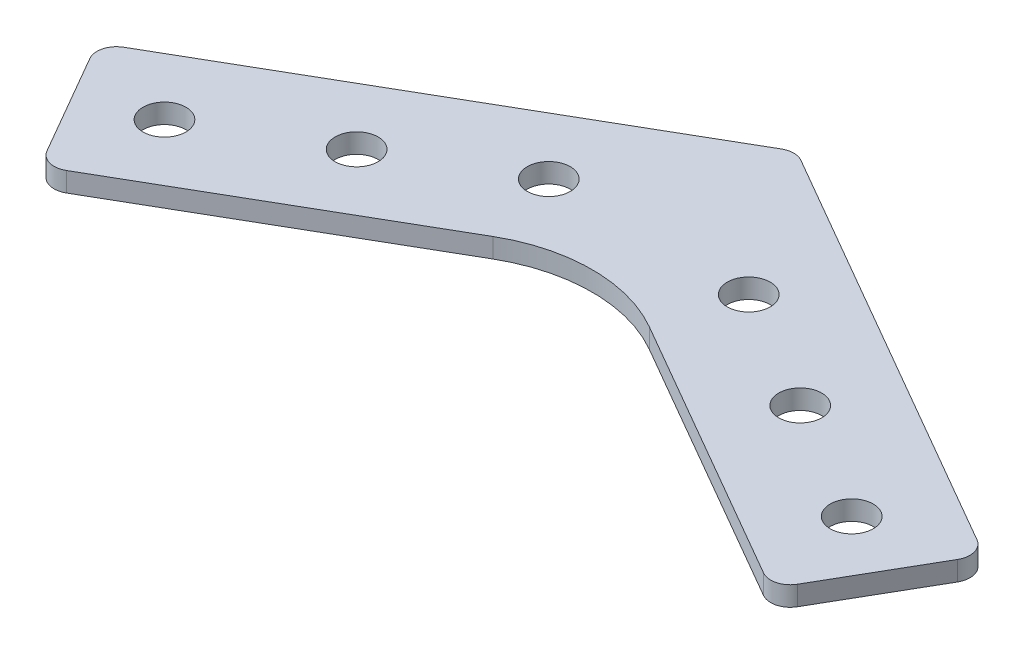
ISO-10303-21;
HEADER;
FILE_DESCRIPTION(('STEP AP214'),'2;1');
FILE_NAME('part.step','',(''),(''),'','','');
FILE_SCHEMA(('AUTOMOTIVE_DESIGN { 1 0 10303 214 1 1 1 1 }'));
ENDSEC;
DATA;
#1=APPLICATION_CONTEXT('core data for automotive mechanical design processes');
#2=APPLICATION_PROTOCOL_DEFINITION('international standard','automotive_design',2000,#1);
#3=PRODUCT_CONTEXT('',#1,'mechanical');
#4=PRODUCT('Part','Part','',(#3));
#5=PRODUCT_RELATED_PRODUCT_CATEGORY('part','',(#4));
#6=PRODUCT_DEFINITION_FORMATION('','',#4);
#7=PRODUCT_DEFINITION_CONTEXT('part definition',#1,'design');
#8=PRODUCT_DEFINITION('design','',#6,#7);
#9=PRODUCT_DEFINITION_SHAPE('','',#8);
#10=(LENGTH_UNIT() NAMED_UNIT(*) SI_UNIT(.MILLI.,.METRE.));
#11=(NAMED_UNIT(*) PLANE_ANGLE_UNIT() SI_UNIT($,.RADIAN.));
#12=(NAMED_UNIT(*) SI_UNIT($,.STERADIAN.) SOLID_ANGLE_UNIT());
#13=UNCERTAINTY_MEASURE_WITH_UNIT(LENGTH_MEASURE(1.E-05),#10,'distance_accuracy_value','');
#14=(GEOMETRIC_REPRESENTATION_CONTEXT(3) GLOBAL_UNCERTAINTY_ASSIGNED_CONTEXT((#13)) GLOBAL_UNIT_ASSIGNED_CONTEXT((#10,
#11,#12)) REPRESENTATION_CONTEXT('',''));
#15=CARTESIAN_POINT('',(0.,0.,0.));
#16=DIRECTION('',(0.,0.,1.));
#17=DIRECTION('',(1.,0.,0.));
#18=AXIS2_PLACEMENT_3D('',#15,#16,#17);
#19=CARTESIAN_POINT('',(-59.3920221915368,3.175,34.29));
#20=DIRECTION('',(-0.866025403784439,0.,0.5));
#21=DIRECTION('',(0.5,0.,0.866025403784439));
#22=AXIS2_PLACEMENT_3D('',#19,#20,#21);
#23=PLANE('',#22);
#24=DIRECTION('',(-0.5,0.,-0.866025403784439));
#25=VECTOR('',#24,1.);
#26=CARTESIAN_POINT('',(-59.3920221915368,3.175,34.29));
#27=LINE('',#26,#25);
#28=CARTESIAN_POINT('',(-60.9795221915368,3.175,31.5403693429844));
#29=VERTEX_POINT('',#28);
#30=CARTESIAN_POINT('',(-70.5045221915368,3.175,15.0425854008908));
#31=VERTEX_POINT('',#30);
#32=EDGE_CURVE('E210',#29,#31,#27,.T.);
#33=ORIENTED_EDGE('',*,*,#32,.T.);
#34=DIRECTION('',(0.,-1.,0.));
#35=VECTOR('',#34,1.);
#36=CARTESIAN_POINT('',(-70.5045221915368,3.175,15.0425854008908));
#37=LINE('',#36,#35);
#38=CARTESIAN_POINT('',(-70.5045221915368,0.,15.0425854008908));
#39=VERTEX_POINT('',#38);
#40=EDGE_CURVE('E146',#31,#39,#37,.T.);
#41=ORIENTED_EDGE('',*,*,#40,.T.);
#42=DIRECTION('',(-0.5,0.,-0.866025403784439));
#43=VECTOR('',#42,1.);
#44=CARTESIAN_POINT('',(-59.3920221915368,0.,34.29));
#45=LINE('',#44,#43);
#46=CARTESIAN_POINT('',(-60.9795221915368,0.,31.5403693429844));
#47=VERTEX_POINT('',#46);
#48=EDGE_CURVE('E130',#47,#39,#45,.T.);
#49=ORIENTED_EDGE('',*,*,#48,.F.);
#50=DIRECTION('',(0.,-1.,0.));
#51=VECTOR('',#50,1.);
#52=CARTESIAN_POINT('',(-60.9795221915368,3.175,31.5403693429844));
#53=LINE('',#52,#51);
#54=EDGE_CURVE('E143',#47,#29,#53,.F.);
#55=ORIENTED_EDGE('',*,*,#54,.T.);
#56=EDGE_LOOP('',(#33,#41,#49,#55));
#57=FACE_BOUND('',#56,.T.);
#58=ADVANCED_FACE('F40',(#57),#23,.T.);
#59=CARTESIAN_POINT('',(0.,3.175,0.));
#60=DIRECTION('',(0.5,0.,0.866025403784439));
#61=DIRECTION('',(0.866025403784439,0.,-0.5));
#62=AXIS2_PLACEMENT_3D('',#59,#60,#61);
#63=PLANE('',#62);
#64=DIRECTION('',(-0.866025403784439,0.,0.5));
#65=VECTOR('',#64,1.);
#66=CARTESIAN_POINT('',(0.,0.,0.));
#67=LINE('',#66,#65);
#68=CARTESIAN_POINT('',(-12.7,0.,7.33234841870827));
#69=VERTEX_POINT('',#68);
#70=CARTESIAN_POINT('',(-56.6423915345212,0.,32.7025));
#71=VERTEX_POINT('',#70);
#72=EDGE_CURVE('E132',#69,#71,#67,.T.);
#73=ORIENTED_EDGE('',*,*,#72,.F.);
#74=DIRECTION('',(0.,-1.,0.));
#75=VECTOR('',#74,1.);
#76=CARTESIAN_POINT('',(-12.7,3.175,7.33234841870827));
#77=LINE('',#76,#75);
#78=CARTESIAN_POINT('',(-12.7,3.175,7.33234841870827));
#79=VERTEX_POINT('',#78);
#80=EDGE_CURVE('E191',#69,#79,#77,.F.);
#81=ORIENTED_EDGE('',*,*,#80,.T.);
#82=DIRECTION('',(-0.866025403784439,0.,0.5));
#83=VECTOR('',#82,1.);
#84=CARTESIAN_POINT('',(0.,3.175,0.));
#85=LINE('',#84,#83);
#86=CARTESIAN_POINT('',(-56.6423915345212,3.175,32.7025));
#87=VERTEX_POINT('',#86);
#88=EDGE_CURVE('E226',#79,#87,#85,.T.);
#89=ORIENTED_EDGE('',*,*,#88,.T.);
#90=DIRECTION('',(0.,-1.,0.));
#91=VECTOR('',#90,1.);
#92=CARTESIAN_POINT('',(-56.6423915345212,3.175,32.7025));
#93=LINE('',#92,#91);
#94=EDGE_CURVE('E176',#87,#71,#93,.T.);
#95=ORIENTED_EDGE('',*,*,#94,.T.);
#96=EDGE_LOOP('',(#73,#81,#89,#95));
#97=FACE_BOUND('',#96,.T.);
#98=ADVANCED_FACE('F299',(#97),#63,.T.);
#99=CARTESIAN_POINT('',(59.3920221915367,3.175,34.2900000000001));
#100=DIRECTION('',(-0.500000000000002,0.,0.866025403784438));
#101=DIRECTION('',(0.866025403784438,0.,0.500000000000002));
#102=AXIS2_PLACEMENT_3D('',#99,#100,#101);
#103=PLANE('',#102);
#104=DIRECTION('',(-0.866025403784438,0.,-0.500000000000002));
#105=VECTOR('',#104,1.);
#106=CARTESIAN_POINT('',(59.3920221915367,3.175,34.2900000000001));
#107=LINE('',#106,#105);
#108=CARTESIAN_POINT('',(56.6423915345211,3.175,32.7025000000001));
#109=VERTEX_POINT('',#108);
#110=CARTESIAN_POINT('',(12.7,3.175,7.33234841870828));
#111=VERTEX_POINT('',#110);
#112=EDGE_CURVE('E223',#109,#111,#107,.T.);
#113=ORIENTED_EDGE('',*,*,#112,.T.);
#114=DIRECTION('',(0.,-1.,0.));
#115=VECTOR('',#114,1.);
#116=CARTESIAN_POINT('',(12.7,0.,7.33234841870829));
#117=LINE('',#116,#115);
#118=CARTESIAN_POINT('',(12.7,0.,7.33234841870828));
#119=VERTEX_POINT('',#118);
#120=EDGE_CURVE('E188',#111,#119,#117,.T.);
#121=ORIENTED_EDGE('',*,*,#120,.T.);
#122=DIRECTION('',(-0.866025403784438,0.,-0.500000000000002));
#123=VECTOR('',#122,1.);
#124=CARTESIAN_POINT('',(59.3920221915367,0.,34.2900000000001));
#125=LINE('',#124,#123);
#126=CARTESIAN_POINT('',(56.6423915345211,0.,32.7025000000001));
#127=VERTEX_POINT('',#126);
#128=EDGE_CURVE('E215',#127,#119,#125,.T.);
#129=ORIENTED_EDGE('',*,*,#128,.F.);
#130=DIRECTION('',(0.,-1.,0.));
#131=VECTOR('',#130,1.);
#132=CARTESIAN_POINT('',(56.6423915345211,3.175,32.7025000000001));
#133=LINE('',#132,#131);
#134=EDGE_CURVE('E186',#127,#109,#133,.F.);
#135=ORIENTED_EDGE('',*,*,#134,.T.);
#136=EDGE_LOOP('',(#113,#121,#129,#135));
#137=FACE_BOUND('',#136,.T.);
#138=ADVANCED_FACE('F304',(#137),#103,.T.);
#139=CARTESIAN_POINT('',(59.3920221915367,3.175,34.2900000000001));
#140=DIRECTION('',(-0.866025403784438,0.,-0.500000000000002));
#141=DIRECTION('',(-0.500000000000002,0.,0.866025403784438));
#142=AXIS2_PLACEMENT_3D('',#139,#140,#141);
#143=PLANE('',#142);
#144=DIRECTION('',(0.500000000000002,0.,-0.866025403784438));
#145=VECTOR('',#144,1.);
#146=CARTESIAN_POINT('',(59.3920221915367,0.,34.2900000000001));
#147=LINE('',#146,#145);
#148=CARTESIAN_POINT('',(60.9795221915367,0.,31.5403693429845));
#149=VERTEX_POINT('',#148);
#150=CARTESIAN_POINT('',(70.5045221915368,0.,15.042585400891));
#151=VERTEX_POINT('',#150);
#152=EDGE_CURVE('E212',#149,#151,#147,.T.);
#153=ORIENTED_EDGE('',*,*,#152,.T.);
#154=DIRECTION('',(0.,-1.,0.));
#155=VECTOR('',#154,1.);
#156=CARTESIAN_POINT('',(70.5045221915368,3.175,15.042585400891));
#157=LINE('',#156,#155);
#158=CARTESIAN_POINT('',(70.5045221915368,3.175,15.042585400891));
#159=VERTEX_POINT('',#158);
#160=EDGE_CURVE('E184',#151,#159,#157,.F.);
#161=ORIENTED_EDGE('',*,*,#160,.T.);
#162=DIRECTION('',(0.500000000000002,0.,-0.866025403784438));
#163=VECTOR('',#162,1.);
#164=CARTESIAN_POINT('',(59.3920221915367,3.175,34.2900000000001));
#165=LINE('',#164,#163);
#166=CARTESIAN_POINT('',(60.9795221915367,3.175,31.5403693429845));
#167=VERTEX_POINT('',#166);
#168=EDGE_CURVE('E157',#167,#159,#165,.T.);
#169=ORIENTED_EDGE('',*,*,#168,.F.);
#170=DIRECTION('',(0.,-1.,0.));
#171=VECTOR('',#170,1.);
#172=CARTESIAN_POINT('',(60.9795221915367,0.,31.5403693429845));
#173=LINE('',#172,#171);
#174=EDGE_CURVE('E181',#167,#149,#173,.T.);
#175=ORIENTED_EDGE('',*,*,#174,.T.);
#176=EDGE_LOOP('',(#153,#161,#169,#175));
#177=FACE_BOUND('',#176,.T.);
#178=ADVANCED_FACE('F328',(#177),#143,.F.);
#179=CARTESIAN_POINT('',(0.,3.175,-29.329393674833));
#180=DIRECTION('',(0.500000000000001,0.,-0.866025403784438));
#181=DIRECTION('',(-0.866025403784438,0.,-0.500000000000001));
#182=AXIS2_PLACEMENT_3D('',#179,#180,#181);
#183=PLANE('',#182);
#184=DIRECTION('',(0.866025403784438,0.,0.500000000000001));
#185=VECTOR('',#184,1.);
#186=CARTESIAN_POINT('',(0.,0.,-29.329393674833));
#187=LINE('',#186,#185);
#188=CARTESIAN_POINT('',(1.5875,0.,-28.4128501224945));
#189=VERTEX_POINT('',#188);
#190=CARTESIAN_POINT('',(69.3423915345212,0.,10.7054547438754));
#191=VERTEX_POINT('',#190);
#192=EDGE_CURVE('E209',#189,#191,#187,.T.);
#193=ORIENTED_EDGE('',*,*,#192,.F.);
#194=DIRECTION('',(0.,-1.,0.));
#195=VECTOR('',#194,1.);
#196=CARTESIAN_POINT('',(1.5875,3.175,-28.4128501224945));
#197=LINE('',#196,#195);
#198=CARTESIAN_POINT('',(1.58750000000001,3.175,-28.4128501224945));
#199=VERTEX_POINT('',#198);
#200=EDGE_CURVE('E48',#189,#199,#197,.F.);
#201=ORIENTED_EDGE('',*,*,#200,.T.);
#202=DIRECTION('',(-0.866025403784438,0.,-0.500000000000002));
#203=VECTOR('',#202,1.);
#204=CARTESIAN_POINT('',(72.0920221915368,3.175,12.2929547438754));
#205=LINE('',#204,#203);
#206=CARTESIAN_POINT('',(69.3423915345212,3.175,10.7054547438754));
#207=VERTEX_POINT('',#206);
#208=EDGE_CURVE('E153',#207,#199,#205,.T.);
#209=ORIENTED_EDGE('',*,*,#208,.F.);
#210=DIRECTION('',(0.,-1.,0.));
#211=VECTOR('',#210,1.);
#212=CARTESIAN_POINT('',(69.3423915345212,0.,10.7054547438754));
#213=LINE('',#212,#211);
#214=EDGE_CURVE('E178',#207,#191,#213,.T.);
#215=ORIENTED_EDGE('',*,*,#214,.T.);
#216=EDGE_LOOP('',(#193,#201,#209,#215));
#217=FACE_BOUND('',#216,.T.);
#218=ADVANCED_FACE('F331',(#217),#183,.T.);
#219=CARTESIAN_POINT('',(-25.3999999999999,3.175,-14.6646968374165));
#220=DIRECTION('',(-0.5,0.,-0.866025403784439));
#221=DIRECTION('',(-0.866025403784439,0.,0.5));
#222=AXIS2_PLACEMENT_3D('',#219,#220,#221);
#223=PLANE('',#222);
#224=DIRECTION('',(-0.866025403784438,0.,0.5));
#225=VECTOR('',#224,1.);
#226=CARTESIAN_POINT('',(-25.3999999999999,3.175,-14.6646968374165));
#227=LINE('',#226,#225);
#228=CARTESIAN_POINT('',(-1.58750000000001,3.175,-28.4128501224945));
#229=VERTEX_POINT('',#228);
#230=CARTESIAN_POINT('',(-69.3423915345212,3.175,10.7054547438753));
#231=VERTEX_POINT('',#230);
#232=EDGE_CURVE('E206',#229,#231,#227,.T.);
#233=ORIENTED_EDGE('',*,*,#232,.F.);
#234=DIRECTION('',(0.,-1.,0.));
#235=VECTOR('',#234,1.);
#236=CARTESIAN_POINT('',(-1.5875,3.175,-28.4128501224945));
#237=LINE('',#236,#235);
#238=CARTESIAN_POINT('',(-1.5875,0.,-28.4128501224945));
#239=VERTEX_POINT('',#238);
#240=EDGE_CURVE('E197',#229,#239,#237,.T.);
#241=ORIENTED_EDGE('',*,*,#240,.T.);
#242=DIRECTION('',(0.866025403784439,0.,-0.5));
#243=VECTOR('',#242,1.);
#244=CARTESIAN_POINT('',(-25.3999999999999,0.,-14.6646968374165));
#245=LINE('',#244,#243);
#246=CARTESIAN_POINT('',(-69.3423915345212,0.,10.7054547438752));
#247=VERTEX_POINT('',#246);
#248=EDGE_CURVE('E160',#247,#239,#245,.T.);
#249=ORIENTED_EDGE('',*,*,#248,.F.);
#250=DIRECTION('',(0.,-1.,0.));
#251=VECTOR('',#250,1.);
#252=CARTESIAN_POINT('',(-69.3423915345212,3.175,10.7054547438752));
#253=LINE('',#252,#251);
#254=EDGE_CURVE('E166',#247,#231,#253,.F.);
#255=ORIENTED_EDGE('',*,*,#254,.T.);
#256=EDGE_LOOP('',(#233,#241,#249,#255));
#257=FACE_BOUND('',#256,.T.);
#258=ADVANCED_FACE('F204',(#257),#223,.T.);
#259=CARTESIAN_POINT('',(0.,3.175,0.));
#260=DIRECTION('',(0.,-1.,0.));
#261=DIRECTION('',(0.,0.,-1.));
#262=AXIS2_PLACEMENT_3D('',#259,#260,#261);
#263=PLANE('',#262);
#264=CARTESIAN_POINT('',(36.0460110957684,3.175,6.14647737193771));
#265=DIRECTION('',(0.,1.,0.));
#266=DIRECTION('',(0.,0.,1.));
#267=AXIS2_PLACEMENT_3D('',#264,#265,#266);
#268=CIRCLE('',#267,3.4925);
#269=CARTESIAN_POINT('',(36.0460110957684,3.175,9.63897737193771));
#270=VERTEX_POINT('',#269);
#271=EDGE_CURVE('E259',#270,#270,#268,.T.);
#272=ORIENTED_EDGE('',*,*,#271,.F.);
#273=EDGE_LOOP('',(#272));
#274=FACE_BOUND('',#273,.T.);
#275=CARTESIAN_POINT('',(16.2486703652561,3.175,-5.28352262806232));
#276=DIRECTION('',(0.,1.,0.));
#277=DIRECTION('',(0.,0.,1.));
#278=AXIS2_PLACEMENT_3D('',#275,#276,#277);
#279=CIRCLE('',#278,3.4925);
#280=CARTESIAN_POINT('',(16.2486703652561,3.175,-1.79102262806232));
#281=VERTEX_POINT('',#280);
#282=EDGE_CURVE('E253',#281,#281,#279,.T.);
#283=ORIENTED_EDGE('',*,*,#282,.F.);
#284=EDGE_LOOP('',(#283));
#285=FACE_BOUND('',#284,.T.);
#286=CARTESIAN_POINT('',(55.8433518262806,3.175,17.5764773719377));
#287=DIRECTION('',(0.,1.,0.));
#288=DIRECTION('',(0.,0.,1.));
#289=AXIS2_PLACEMENT_3D('',#286,#287,#288);
#290=CIRCLE('',#289,3.4925);
#291=CARTESIAN_POINT('',(55.8433518262806,3.175,21.0689773719377));
#292=VERTEX_POINT('',#291);
#293=EDGE_CURVE('E247',#292,#292,#290,.T.);
#294=ORIENTED_EDGE('',*,*,#293,.F.);
#295=EDGE_LOOP('',(#294));
#296=FACE_BOUND('',#295,.T.);
#297=CARTESIAN_POINT('',(-36.0460110957684,3.175,6.14647737193763));
#298=DIRECTION('',(0.,1.,0.));
#299=DIRECTION('',(0.,0.,1.));
#300=AXIS2_PLACEMENT_3D('',#297,#298,#299);
#301=CIRCLE('',#300,3.49250000000001);
#302=CARTESIAN_POINT('',(-36.0460110957684,3.175,9.63897737193764));
#303=VERTEX_POINT('',#302);
#304=EDGE_CURVE('E242',#303,#303,#301,.T.);
#305=ORIENTED_EDGE('',*,*,#304,.F.);
#306=EDGE_LOOP('',(#305));
#307=FACE_BOUND('',#306,.T.);
#308=CARTESIAN_POINT('',(-16.2486703652561,3.175,-5.28352262806237));
#309=DIRECTION('',(0.,1.,0.));
#310=DIRECTION('',(0.,0.,1.));
#311=AXIS2_PLACEMENT_3D('',#308,#309,#310);
#312=CIRCLE('',#311,3.49250000000001);
#313=CARTESIAN_POINT('',(-16.2486703652561,3.175,-1.79102262806237));
#314=VERTEX_POINT('',#313);
#315=EDGE_CURVE('E235',#314,#314,#312,.T.);
#316=ORIENTED_EDGE('',*,*,#315,.F.);
#317=EDGE_LOOP('',(#316));
#318=FACE_BOUND('',#317,.T.);
#319=CARTESIAN_POINT('',(-55.8433518262807,3.175,17.5764773719376));
#320=DIRECTION('',(0.,1.,0.));
#321=DIRECTION('',(0.,0.,1.));
#322=AXIS2_PLACEMENT_3D('',#319,#320,#321);
#323=CIRCLE('',#322,3.49250000000001);
#324=CARTESIAN_POINT('',(-55.8433518262807,3.175,21.0689773719376));
#325=VERTEX_POINT('',#324);
#326=EDGE_CURVE('E229',#325,#325,#323,.T.);
#327=ORIENTED_EDGE('',*,*,#326,.F.);
#328=EDGE_LOOP('',(#327));
#329=FACE_BOUND('',#328,.T.);
#330=ORIENTED_EDGE('',*,*,#208,.T.);
#331=CARTESIAN_POINT('',(0.,3.175,-25.6632194654789));
#332=DIRECTION('',(0.,-1.,0.));
#333=DIRECTION('',(0.,0.,-1.));
#334=AXIS2_PLACEMENT_3D('',#331,#332,#333);
#335=CIRCLE('',#334,3.175);
#336=EDGE_CURVE('E11',#199,#229,#335,.F.);
#337=ORIENTED_EDGE('',*,*,#336,.T.);
#338=ORIENTED_EDGE('',*,*,#232,.T.);
#339=CARTESIAN_POINT('',(-67.7548915345212,3.175,13.4550854008908));
#340=DIRECTION('',(0.,-1.,0.));
#341=DIRECTION('',(0.,0.,-1.));
#342=AXIS2_PLACEMENT_3D('',#339,#340,#341);
#343=CIRCLE('',#342,3.175);
#344=EDGE_CURVE('E174',#231,#31,#343,.F.);
#345=ORIENTED_EDGE('',*,*,#344,.T.);
#346=ORIENTED_EDGE('',*,*,#32,.F.);
#347=CARTESIAN_POINT('',(-58.2298915345212,3.175,29.9528693429844));
#348=DIRECTION('',(0.,-1.,0.));
#349=DIRECTION('',(0.,0.,-1.));
#350=AXIS2_PLACEMENT_3D('',#347,#348,#349);
#351=CIRCLE('',#350,3.175);
#352=EDGE_CURVE('E152',#29,#87,#351,.F.);
#353=ORIENTED_EDGE('',*,*,#352,.T.);
#354=ORIENTED_EDGE('',*,*,#88,.F.);
#355=CARTESIAN_POINT('',(0.,3.175,29.329393674833));
#356=DIRECTION('',(0.,-1.,0.));
#357=DIRECTION('',(0.,0.,-1.));
#358=AXIS2_PLACEMENT_3D('',#355,#356,#357);
#359=CIRCLE('',#358,25.4);
#360=EDGE_CURVE('E195',#79,#111,#359,.T.);
#361=ORIENTED_EDGE('',*,*,#360,.T.);
#362=ORIENTED_EDGE('',*,*,#112,.F.);
#363=CARTESIAN_POINT('',(58.2298915345212,3.175,29.9528693429845));
#364=DIRECTION('',(0.,-1.,0.));
#365=DIRECTION('',(0.,0.,-1.));
#366=AXIS2_PLACEMENT_3D('',#363,#364,#365);
#367=CIRCLE('',#366,3.175);
#368=EDGE_CURVE('E169',#109,#167,#367,.F.);
#369=ORIENTED_EDGE('',*,*,#368,.T.);
#370=ORIENTED_EDGE('',*,*,#168,.T.);
#371=CARTESIAN_POINT('',(67.7548915345212,3.175,13.455085400891));
#372=DIRECTION('',(0.,-1.,0.));
#373=DIRECTION('',(0.,0.,-1.));
#374=AXIS2_PLACEMENT_3D('',#371,#372,#373);
#375=CIRCLE('',#374,3.175);
#376=EDGE_CURVE('E171',#159,#207,#375,.F.);
#377=ORIENTED_EDGE('',*,*,#376,.T.);
#378=EDGE_LOOP('',(#330,#337,#338,#345,#346,#353,#354,#361,#362,#369,#370,#377));
#379=FACE_BOUND('',#378,.T.);
#380=ADVANCED_FACE('F275',(#274,#285,#296,#307,#318,#329,#379),#263,.F.);
#381=CARTESIAN_POINT('',(0.,0.,0.));
#382=DIRECTION('',(0.,-1.,0.));
#383=DIRECTION('',(0.,0.,-1.));
#384=AXIS2_PLACEMENT_3D('',#381,#382,#383);
#385=PLANE('',#384);
#386=CARTESIAN_POINT('',(36.0460110957684,0.,6.14647737193771));
#387=DIRECTION('',(0.,1.,0.));
#388=DIRECTION('',(0.,0.,1.));
#389=AXIS2_PLACEMENT_3D('',#386,#387,#388);
#390=CIRCLE('',#389,3.4925);
#391=CARTESIAN_POINT('',(36.0460110957684,0.,9.63897737193771));
#392=VERTEX_POINT('',#391);
#393=EDGE_CURVE('E250',#392,#392,#390,.T.);
#394=ORIENTED_EDGE('',*,*,#393,.T.);
#395=EDGE_LOOP('',(#394));
#396=FACE_BOUND('',#395,.T.);
#397=CARTESIAN_POINT('',(16.2486703652561,0.,-5.28352262806232));
#398=DIRECTION('',(0.,1.,0.));
#399=DIRECTION('',(0.,0.,1.));
#400=AXIS2_PLACEMENT_3D('',#397,#398,#399);
#401=CIRCLE('',#400,3.4925);
#402=CARTESIAN_POINT('',(16.2486703652561,0.,-1.79102262806232));
#403=VERTEX_POINT('',#402);
#404=EDGE_CURVE('E256',#403,#403,#401,.T.);
#405=ORIENTED_EDGE('',*,*,#404,.T.);
#406=EDGE_LOOP('',(#405));
#407=FACE_BOUND('',#406,.T.);
#408=CARTESIAN_POINT('',(55.8433518262806,0.,17.5764773719377));
#409=DIRECTION('',(0.,1.,0.));
#410=DIRECTION('',(0.,0.,1.));
#411=AXIS2_PLACEMENT_3D('',#408,#409,#410);
#412=CIRCLE('',#411,3.4925);
#413=CARTESIAN_POINT('',(55.8433518262806,0.,21.0689773719377));
#414=VERTEX_POINT('',#413);
#415=EDGE_CURVE('E239',#414,#414,#412,.T.);
#416=ORIENTED_EDGE('',*,*,#415,.T.);
#417=EDGE_LOOP('',(#416));
#418=FACE_BOUND('',#417,.T.);
#419=CARTESIAN_POINT('',(-36.0460110957684,0.,6.14647737193763));
#420=DIRECTION('',(0.,1.,0.));
#421=DIRECTION('',(0.,0.,1.));
#422=AXIS2_PLACEMENT_3D('',#419,#420,#421);
#423=CIRCLE('',#422,3.49250000000001);
#424=CARTESIAN_POINT('',(-36.0460110957684,0.,9.63897737193764));
#425=VERTEX_POINT('',#424);
#426=EDGE_CURVE('E232',#425,#425,#423,.T.);
#427=ORIENTED_EDGE('',*,*,#426,.T.);
#428=EDGE_LOOP('',(#427));
#429=FACE_BOUND('',#428,.T.);
#430=CARTESIAN_POINT('',(-16.2486703652561,0.,-5.28352262806237));
#431=DIRECTION('',(0.,1.,0.));
#432=DIRECTION('',(0.,0.,1.));
#433=AXIS2_PLACEMENT_3D('',#430,#431,#432);
#434=CIRCLE('',#433,3.49250000000001);
#435=CARTESIAN_POINT('',(-16.2486703652561,0.,-1.79102262806237));
#436=VERTEX_POINT('',#435);
#437=EDGE_CURVE('E238',#436,#436,#434,.T.);
#438=ORIENTED_EDGE('',*,*,#437,.T.);
#439=EDGE_LOOP('',(#438));
#440=FACE_BOUND('',#439,.T.);
#441=CARTESIAN_POINT('',(-55.8433518262807,0.,17.5764773719376));
#442=DIRECTION('',(0.,1.,0.));
#443=DIRECTION('',(0.,0.,1.));
#444=AXIS2_PLACEMENT_3D('',#441,#442,#443);
#445=CIRCLE('',#444,3.49250000000001);
#446=CARTESIAN_POINT('',(-55.8433518262807,0.,21.0689773719376));
#447=VERTEX_POINT('',#446);
#448=EDGE_CURVE('E147',#447,#447,#445,.T.);
#449=ORIENTED_EDGE('',*,*,#448,.T.);
#450=EDGE_LOOP('',(#449));
#451=FACE_BOUND('',#450,.T.);
#452=ORIENTED_EDGE('',*,*,#248,.T.);
#453=CARTESIAN_POINT('',(0.,0.,-25.6632194654789));
#454=DIRECTION('',(0.,-1.,0.));
#455=DIRECTION('',(0.,0.,-1.));
#456=AXIS2_PLACEMENT_3D('',#453,#454,#455);
#457=CIRCLE('',#456,3.175);
#458=EDGE_CURVE('E62',#239,#189,#457,.T.);
#459=ORIENTED_EDGE('',*,*,#458,.T.);
#460=ORIENTED_EDGE('',*,*,#192,.T.);
#461=CARTESIAN_POINT('',(67.7548915345212,0.,13.455085400891));
#462=DIRECTION('',(0.,-1.,0.));
#463=DIRECTION('',(0.,0.,-1.));
#464=AXIS2_PLACEMENT_3D('',#461,#462,#463);
#465=CIRCLE('',#464,3.175);
#466=EDGE_CURVE('E138',#191,#151,#465,.T.);
#467=ORIENTED_EDGE('',*,*,#466,.T.);
#468=ORIENTED_EDGE('',*,*,#152,.F.);
#469=CARTESIAN_POINT('',(58.2298915345212,0.,29.9528693429845));
#470=DIRECTION('',(0.,-1.,0.));
#471=DIRECTION('',(0.,0.,-1.));
#472=AXIS2_PLACEMENT_3D('',#469,#470,#471);
#473=CIRCLE('',#472,3.175);
#474=EDGE_CURVE('E155',#149,#127,#473,.T.);
#475=ORIENTED_EDGE('',*,*,#474,.T.);
#476=ORIENTED_EDGE('',*,*,#128,.T.);
#477=CARTESIAN_POINT('',(0.,0.,29.329393674833));
#478=DIRECTION('',(0.,-1.,0.));
#479=DIRECTION('',(0.,0.,-1.));
#480=AXIS2_PLACEMENT_3D('',#477,#478,#479);
#481=CIRCLE('',#480,25.4);
#482=EDGE_CURVE('E193',#119,#69,#481,.F.);
#483=ORIENTED_EDGE('',*,*,#482,.T.);
#484=ORIENTED_EDGE('',*,*,#72,.T.);
#485=CARTESIAN_POINT('',(-58.2298915345212,0.,29.9528693429844));
#486=DIRECTION('',(0.,-1.,0.));
#487=DIRECTION('',(0.,0.,-1.));
#488=AXIS2_PLACEMENT_3D('',#485,#486,#487);
#489=CIRCLE('',#488,3.175);
#490=EDGE_CURVE('E127',#71,#47,#489,.T.);
#491=ORIENTED_EDGE('',*,*,#490,.T.);
#492=ORIENTED_EDGE('',*,*,#48,.T.);
#493=CARTESIAN_POINT('',(-67.7548915345212,0.,13.4550854008908));
#494=DIRECTION('',(0.,-1.,0.));
#495=DIRECTION('',(0.,0.,-1.));
#496=AXIS2_PLACEMENT_3D('',#493,#494,#495);
#497=CIRCLE('',#496,3.175);
#498=EDGE_CURVE('E137',#39,#247,#497,.T.);
#499=ORIENTED_EDGE('',*,*,#498,.T.);
#500=EDGE_LOOP('',(#452,#459,#460,#467,#468,#475,#476,#483,#484,#491,#492,#499));
#501=FACE_BOUND('',#500,.T.);
#502=ADVANCED_FACE('F129',(#396,#407,#418,#429,#440,#451,#501),#385,.T.);
#503=CARTESIAN_POINT('',(-55.8433518262807,0.,17.5764773719376));
#504=DIRECTION('',(0.,1.,0.));
#505=DIRECTION('',(0.,0.,1.));
#506=AXIS2_PLACEMENT_3D('',#503,#504,#505);
#507=CYLINDRICAL_SURFACE('',#506,3.49250000000001);
#508=ORIENTED_EDGE('',*,*,#448,.F.);
#509=EDGE_LOOP('',(#508));
#510=FACE_BOUND('',#509,.T.);
#511=ORIENTED_EDGE('',*,*,#326,.T.);
#512=EDGE_LOOP('',(#511));
#513=FACE_BOUND('',#512,.T.);
#514=ADVANCED_FACE('F431',(#510,#513),#507,.F.);
#515=CARTESIAN_POINT('',(-16.2486703652561,0.,-5.28352262806237));
#516=DIRECTION('',(0.,1.,0.));
#517=DIRECTION('',(0.,0.,1.));
#518=AXIS2_PLACEMENT_3D('',#515,#516,#517);
#519=CYLINDRICAL_SURFACE('',#518,3.49250000000001);
#520=ORIENTED_EDGE('',*,*,#437,.F.);
#521=EDGE_LOOP('',(#520));
#522=FACE_BOUND('',#521,.T.);
#523=ORIENTED_EDGE('',*,*,#315,.T.);
#524=EDGE_LOOP('',(#523));
#525=FACE_BOUND('',#524,.T.);
#526=ADVANCED_FACE('F439',(#522,#525),#519,.F.);
#527=CARTESIAN_POINT('',(-36.0460110957684,0.,6.14647737193763));
#528=DIRECTION('',(0.,1.,0.));
#529=DIRECTION('',(0.,0.,1.));
#530=AXIS2_PLACEMENT_3D('',#527,#528,#529);
#531=CYLINDRICAL_SURFACE('',#530,3.49250000000001);
#532=ORIENTED_EDGE('',*,*,#426,.F.);
#533=EDGE_LOOP('',(#532));
#534=FACE_BOUND('',#533,.T.);
#535=ORIENTED_EDGE('',*,*,#304,.T.);
#536=EDGE_LOOP('',(#535));
#537=FACE_BOUND('',#536,.T.);
#538=ADVANCED_FACE('F449',(#534,#537),#531,.F.);
#539=CARTESIAN_POINT('',(55.8433518262806,0.,17.5764773719377));
#540=DIRECTION('',(0.,1.,0.));
#541=DIRECTION('',(0.,0.,1.));
#542=AXIS2_PLACEMENT_3D('',#539,#540,#541);
#543=CYLINDRICAL_SURFACE('',#542,3.4925);
#544=ORIENTED_EDGE('',*,*,#415,.F.);
#545=EDGE_LOOP('',(#544));
#546=FACE_BOUND('',#545,.T.);
#547=ORIENTED_EDGE('',*,*,#293,.T.);
#548=EDGE_LOOP('',(#547));
#549=FACE_BOUND('',#548,.T.);
#550=ADVANCED_FACE('F459',(#546,#549),#543,.F.);
#551=CARTESIAN_POINT('',(16.2486703652561,0.,-5.28352262806232));
#552=DIRECTION('',(0.,1.,0.));
#553=DIRECTION('',(0.,0.,1.));
#554=AXIS2_PLACEMENT_3D('',#551,#552,#553);
#555=CYLINDRICAL_SURFACE('',#554,3.4925);
#556=ORIENTED_EDGE('',*,*,#404,.F.);
#557=EDGE_LOOP('',(#556));
#558=FACE_BOUND('',#557,.T.);
#559=ORIENTED_EDGE('',*,*,#282,.T.);
#560=EDGE_LOOP('',(#559));
#561=FACE_BOUND('',#560,.T.);
#562=ADVANCED_FACE('F271',(#558,#561),#555,.F.);
#563=CARTESIAN_POINT('',(36.0460110957684,0.,6.14647737193771));
#564=DIRECTION('',(0.,1.,0.));
#565=DIRECTION('',(0.,0.,1.));
#566=AXIS2_PLACEMENT_3D('',#563,#564,#565);
#567=CYLINDRICAL_SURFACE('',#566,3.4925);
#568=ORIENTED_EDGE('',*,*,#393,.F.);
#569=EDGE_LOOP('',(#568));
#570=FACE_BOUND('',#569,.T.);
#571=ORIENTED_EDGE('',*,*,#271,.T.);
#572=EDGE_LOOP('',(#571));
#573=FACE_BOUND('',#572,.T.);
#574=ADVANCED_FACE('F267',(#570,#573),#567,.F.);
#575=CARTESIAN_POINT('',(-67.7548915345212,3.175,13.4550854008908));
#576=DIRECTION('',(0.,-1.,0.));
#577=DIRECTION('',(0.,0.,-1.));
#578=AXIS2_PLACEMENT_3D('',#575,#576,#577);
#579=CYLINDRICAL_SURFACE('',#578,3.175);
#580=ORIENTED_EDGE('',*,*,#344,.F.);
#581=ORIENTED_EDGE('',*,*,#254,.F.);
#582=ORIENTED_EDGE('',*,*,#498,.F.);
#583=ORIENTED_EDGE('',*,*,#40,.F.);
#584=EDGE_LOOP('',(#580,#581,#582,#583));
#585=FACE_BOUND('',#584,.T.);
#586=ADVANCED_FACE('F270',(#585),#579,.T.);
#587=CARTESIAN_POINT('',(-58.2298915345212,3.175,29.9528693429844));
#588=DIRECTION('',(0.,-1.,0.));
#589=DIRECTION('',(0.,0.,-1.));
#590=AXIS2_PLACEMENT_3D('',#587,#588,#589);
#591=CYLINDRICAL_SURFACE('',#590,3.175);
#592=ORIENTED_EDGE('',*,*,#352,.F.);
#593=ORIENTED_EDGE('',*,*,#54,.F.);
#594=ORIENTED_EDGE('',*,*,#490,.F.);
#595=ORIENTED_EDGE('',*,*,#94,.F.);
#596=EDGE_LOOP('',(#592,#593,#594,#595));
#597=FACE_BOUND('',#596,.T.);
#598=ADVANCED_FACE('F150',(#597),#591,.T.);
#599=CARTESIAN_POINT('',(67.7548915345212,3.175,13.455085400891));
#600=DIRECTION('',(0.,1.,0.));
#601=DIRECTION('',(0.,0.,1.));
#602=AXIS2_PLACEMENT_3D('',#599,#600,#601);
#603=CYLINDRICAL_SURFACE('',#602,3.175);
#604=ORIENTED_EDGE('',*,*,#376,.F.);
#605=ORIENTED_EDGE('',*,*,#160,.F.);
#606=ORIENTED_EDGE('',*,*,#466,.F.);
#607=ORIENTED_EDGE('',*,*,#214,.F.);
#608=EDGE_LOOP('',(#604,#605,#606,#607));
#609=FACE_BOUND('',#608,.T.);
#610=ADVANCED_FACE('F314',(#609),#603,.T.);
#611=CARTESIAN_POINT('',(58.2298915345212,3.175,29.9528693429845));
#612=DIRECTION('',(0.,1.,0.));
#613=DIRECTION('',(0.,0.,1.));
#614=AXIS2_PLACEMENT_3D('',#611,#612,#613);
#615=CYLINDRICAL_SURFACE('',#614,3.175);
#616=ORIENTED_EDGE('',*,*,#368,.F.);
#617=ORIENTED_EDGE('',*,*,#134,.F.);
#618=ORIENTED_EDGE('',*,*,#474,.F.);
#619=ORIENTED_EDGE('',*,*,#174,.F.);
#620=EDGE_LOOP('',(#616,#617,#618,#619));
#621=FACE_BOUND('',#620,.T.);
#622=ADVANCED_FACE('F296',(#621),#615,.T.);
#623=CARTESIAN_POINT('',(0.,3.175,29.329393674833));
#624=DIRECTION('',(0.,1.,0.));
#625=DIRECTION('',(0.,0.,1.));
#626=AXIS2_PLACEMENT_3D('',#623,#624,#625);
#627=CYLINDRICAL_SURFACE('',#626,25.4);
#628=ORIENTED_EDGE('',*,*,#360,.F.);
#629=ORIENTED_EDGE('',*,*,#80,.F.);
#630=ORIENTED_EDGE('',*,*,#482,.F.);
#631=ORIENTED_EDGE('',*,*,#120,.F.);
#632=EDGE_LOOP('',(#628,#629,#630,#631));
#633=FACE_BOUND('',#632,.T.);
#634=ADVANCED_FACE('F292',(#633),#627,.F.);
#635=CARTESIAN_POINT('',(0.,3.175,-25.6632194654789));
#636=DIRECTION('',(0.,-1.,0.));
#637=DIRECTION('',(0.,0.,-1.));
#638=AXIS2_PLACEMENT_3D('',#635,#636,#637);
#639=CYLINDRICAL_SURFACE('',#638,3.175);
#640=ORIENTED_EDGE('',*,*,#336,.F.);
#641=ORIENTED_EDGE('',*,*,#200,.F.);
#642=ORIENTED_EDGE('',*,*,#458,.F.);
#643=ORIENTED_EDGE('',*,*,#240,.F.);
#644=EDGE_LOOP('',(#640,#641,#642,#643));
#645=FACE_BOUND('',#644,.T.);
#646=ADVANCED_FACE('F42',(#645),#639,.T.);
#647=CLOSED_SHELL('',(#58,#98,#138,#178,#218,#258,#380,#502,#514,#526,#538,#550,#562,#574,#586,
#598,#610,#622,#634,#646));
#648=MANIFOLD_SOLID_BREP('B2',#647);
#649=ADVANCED_BREP_SHAPE_REPRESENTATION('',(#18,#648),#14);
#650=SHAPE_DEFINITION_REPRESENTATION(#9,#649);
ENDSEC;
END-ISO-10303-21;
